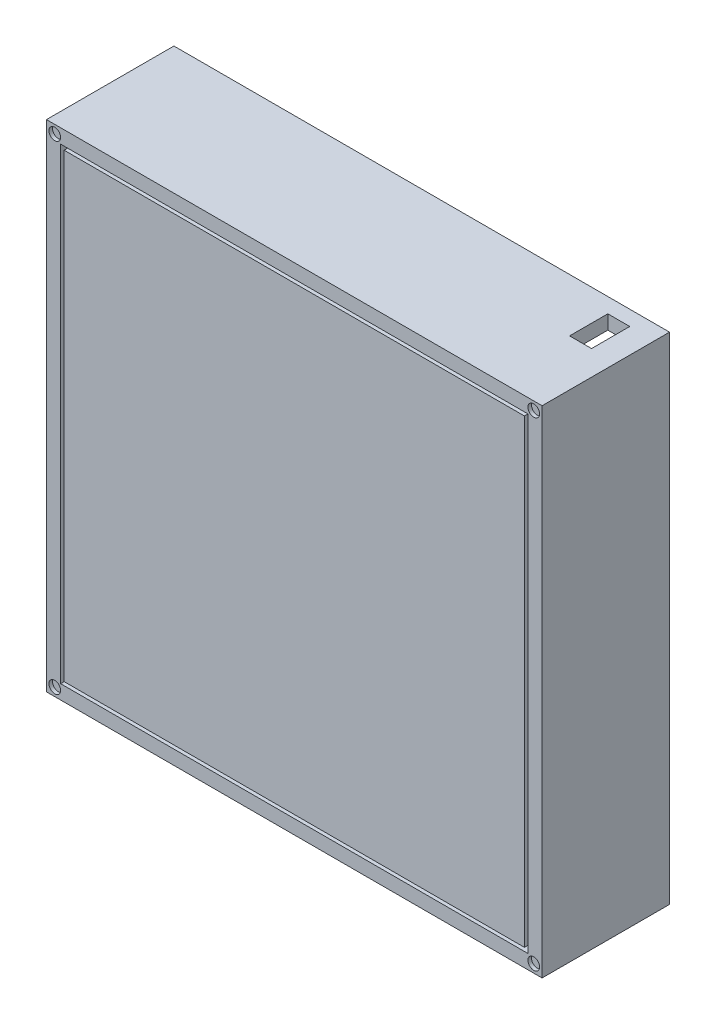
ISO-10303-21;
HEADER;
FILE_DESCRIPTION(('STEP AP214'),'2;1');
FILE_NAME('part.step','',(''),(''),'','','');
FILE_SCHEMA(('AUTOMOTIVE_DESIGN { 1 0 10303 214 1 1 1 1 }'));
ENDSEC;
DATA;
#1=APPLICATION_CONTEXT('core data for automotive mechanical design processes');
#2=APPLICATION_PROTOCOL_DEFINITION('international standard','automotive_design',2000,#1);
#3=PRODUCT_CONTEXT('',#1,'mechanical');
#4=PRODUCT('Part','Part','',(#3));
#5=PRODUCT_RELATED_PRODUCT_CATEGORY('part','',(#4));
#6=PRODUCT_DEFINITION_FORMATION('','',#4);
#7=PRODUCT_DEFINITION_CONTEXT('part definition',#1,'design');
#8=PRODUCT_DEFINITION('design','',#6,#7);
#9=PRODUCT_DEFINITION_SHAPE('','',#8);
#10=(LENGTH_UNIT() NAMED_UNIT(*) SI_UNIT(.MILLI.,.METRE.));
#11=(NAMED_UNIT(*) PLANE_ANGLE_UNIT() SI_UNIT($,.RADIAN.));
#12=(NAMED_UNIT(*) SI_UNIT($,.STERADIAN.) SOLID_ANGLE_UNIT());
#13=UNCERTAINTY_MEASURE_WITH_UNIT(LENGTH_MEASURE(1.E-05),#10,'distance_accuracy_value','');
#14=(GEOMETRIC_REPRESENTATION_CONTEXT(3) GLOBAL_UNCERTAINTY_ASSIGNED_CONTEXT((#13)) GLOBAL_UNIT_ASSIGNED_CONTEXT((#10,
#11,#12)) REPRESENTATION_CONTEXT('',''));
#15=CARTESIAN_POINT('',(0.,0.,0.));
#16=DIRECTION('',(0.,0.,1.));
#17=DIRECTION('',(1.,0.,0.));
#18=AXIS2_PLACEMENT_3D('',#15,#16,#17);
#19=CARTESIAN_POINT('',(70.,70.,-26.));
#20=DIRECTION('',(0.,1.,0.));
#21=DIRECTION('',(-1.,0.,0.));
#22=AXIS2_PLACEMENT_3D('',#19,#20,#21);
#23=PLANE('',#22);
#24=DIRECTION('',(-1.,0.,0.));
#25=VECTOR('',#24,1.);
#26=CARTESIAN_POINT('',(70.,70.,10.));
#27=LINE('',#26,#25);
#28=CARTESIAN_POINT('',(70.,70.,10.));
#29=VERTEX_POINT('',#28);
#30=CARTESIAN_POINT('',(-70.,70.,10.));
#31=VERTEX_POINT('',#30);
#32=EDGE_CURVE('E341',#29,#31,#27,.T.);
#33=ORIENTED_EDGE('',*,*,#32,.F.);
#34=DIRECTION('',(0.,0.,1.));
#35=VECTOR('',#34,1.);
#36=CARTESIAN_POINT('',(70.,70.,-26.));
#37=LINE('',#36,#35);
#38=CARTESIAN_POINT('',(70.,70.,-26.));
#39=VERTEX_POINT('',#38);
#40=EDGE_CURVE('E372',#39,#29,#37,.T.);
#41=ORIENTED_EDGE('',*,*,#40,.F.);
#42=DIRECTION('',(-1.,0.,0.));
#43=VECTOR('',#42,1.);
#44=CARTESIAN_POINT('',(70.,70.,-26.));
#45=LINE('',#44,#43);
#46=CARTESIAN_POINT('',(-70.,70.,-26.));
#47=VERTEX_POINT('',#46);
#48=EDGE_CURVE('E348',#39,#47,#45,.T.);
#49=ORIENTED_EDGE('',*,*,#48,.T.);
#50=DIRECTION('',(0.,0.,1.));
#51=VECTOR('',#50,1.);
#52=CARTESIAN_POINT('',(-70.,70.,-26.));
#53=LINE('',#52,#51);
#54=EDGE_CURVE('E362',#47,#31,#53,.T.);
#55=ORIENTED_EDGE('',*,*,#54,.T.);
#56=EDGE_LOOP('',(#33,#41,#49,#55));
#57=FACE_BOUND('',#56,.T.);
#58=DIRECTION('',(0.,0.,-1.));
#59=VECTOR('',#58,1.);
#60=CARTESIAN_POINT('',(56.8,70.,-10.9680724745506));
#61=LINE('',#60,#59);
#62=CARTESIAN_POINT('',(56.8,70.,-10.9680724745506));
#63=VERTEX_POINT('',#62);
#64=CARTESIAN_POINT('',(56.8,70.,-21.7680724745506));
#65=VERTEX_POINT('',#64);
#66=EDGE_CURVE('E232',#63,#65,#61,.T.);
#67=ORIENTED_EDGE('',*,*,#66,.T.);
#68=DIRECTION('',(1.,0.,0.));
#69=VECTOR('',#68,1.);
#70=CARTESIAN_POINT('',(56.8,70.,-21.7680724745506));
#71=LINE('',#70,#69);
#72=CARTESIAN_POINT('',(63.,70.,-21.7680724745506));
#73=VERTEX_POINT('',#72);
#74=EDGE_CURVE('E93',#65,#73,#71,.T.);
#75=ORIENTED_EDGE('',*,*,#74,.T.);
#76=DIRECTION('',(0.,0.,-1.));
#77=VECTOR('',#76,1.);
#78=CARTESIAN_POINT('',(63.,70.,-10.9680724745506));
#79=LINE('',#78,#77);
#80=CARTESIAN_POINT('',(63.,70.,-10.9680724745506));
#81=VERTEX_POINT('',#80);
#82=EDGE_CURVE('E223',#81,#73,#79,.T.);
#83=ORIENTED_EDGE('',*,*,#82,.F.);
#84=DIRECTION('',(1.,0.,0.));
#85=VECTOR('',#84,1.);
#86=CARTESIAN_POINT('',(56.8,70.,-10.9680724745506));
#87=LINE('',#86,#85);
#88=EDGE_CURVE('E229',#63,#81,#87,.T.);
#89=ORIENTED_EDGE('',*,*,#88,.F.);
#90=EDGE_LOOP('',(#67,#75,#83,#89));
#91=FACE_BOUND('',#90,.T.);
#92=ADVANCED_FACE('F79',(#57,#91),#23,.T.);
#93=CARTESIAN_POINT('',(66.,66.,-26.));
#94=DIRECTION('',(0.,1.,0.));
#95=DIRECTION('',(0.,0.,1.));
#96=AXIS2_PLACEMENT_3D('',#93,#94,#95);
#97=PLANE('',#96);
#98=DIRECTION('',(-1.,0.,0.));
#99=VECTOR('',#98,1.);
#100=CARTESIAN_POINT('',(66.,66.,10.));
#101=LINE('',#100,#99);
#102=CARTESIAN_POINT('',(66.,66.,10.));
#103=VERTEX_POINT('',#102);
#104=CARTESIAN_POINT('',(-66.,66.,10.));
#105=VERTEX_POINT('',#104);
#106=EDGE_CURVE('E312',#103,#105,#101,.T.);
#107=ORIENTED_EDGE('',*,*,#106,.T.);
#108=DIRECTION('',(0.,0.,1.));
#109=VECTOR('',#108,1.);
#110=CARTESIAN_POINT('',(-66.,66.,-26.));
#111=LINE('',#110,#109);
#112=CARTESIAN_POINT('',(-66.,66.,-26.));
#113=VERTEX_POINT('',#112);
#114=EDGE_CURVE('E329',#113,#105,#111,.T.);
#115=ORIENTED_EDGE('',*,*,#114,.F.);
#116=DIRECTION('',(-1.,0.,0.));
#117=VECTOR('',#116,1.);
#118=CARTESIAN_POINT('',(66.,66.,-26.));
#119=LINE('',#118,#117);
#120=CARTESIAN_POINT('',(66.,66.,-26.));
#121=VERTEX_POINT('',#120);
#122=EDGE_CURVE('E315',#121,#113,#119,.T.);
#123=ORIENTED_EDGE('',*,*,#122,.F.);
#124=DIRECTION('',(0.,0.,1.));
#125=VECTOR('',#124,1.);
#126=CARTESIAN_POINT('',(66.,66.,-26.));
#127=LINE('',#126,#125);
#128=EDGE_CURVE('E339',#121,#103,#127,.T.);
#129=ORIENTED_EDGE('',*,*,#128,.T.);
#130=EDGE_LOOP('',(#107,#115,#123,#129));
#131=FACE_BOUND('',#130,.T.);
#132=DIRECTION('',(1.,0.,0.));
#133=VECTOR('',#132,1.);
#134=CARTESIAN_POINT('',(66.,66.,-21.7680724745506));
#135=LINE('',#134,#133);
#136=CARTESIAN_POINT('',(56.8,66.,-21.7680724745506));
#137=VERTEX_POINT('',#136);
#138=CARTESIAN_POINT('',(63.,66.,-21.7680724745506));
#139=VERTEX_POINT('',#138);
#140=EDGE_CURVE('E13',#137,#139,#135,.T.);
#141=ORIENTED_EDGE('',*,*,#140,.F.);
#142=DIRECTION('',(0.,0.,-1.));
#143=VECTOR('',#142,1.);
#144=CARTESIAN_POINT('',(56.8,66.,-26.));
#145=LINE('',#144,#143);
#146=CARTESIAN_POINT('',(56.8,66.,-10.9680724745506));
#147=VERTEX_POINT('',#146);
#148=EDGE_CURVE('E374',#147,#137,#145,.T.);
#149=ORIENTED_EDGE('',*,*,#148,.F.);
#150=DIRECTION('',(1.,0.,0.));
#151=VECTOR('',#150,1.);
#152=CARTESIAN_POINT('',(66.,66.,-10.9680724745506));
#153=LINE('',#152,#151);
#154=CARTESIAN_POINT('',(63.,66.,-10.9680724745506));
#155=VERTEX_POINT('',#154);
#156=EDGE_CURVE('E382',#147,#155,#153,.T.);
#157=ORIENTED_EDGE('',*,*,#156,.T.);
#158=DIRECTION('',(0.,0.,-1.));
#159=VECTOR('',#158,1.);
#160=CARTESIAN_POINT('',(63.,66.,-26.));
#161=LINE('',#160,#159);
#162=EDGE_CURVE('E86',#155,#139,#161,.T.);
#163=ORIENTED_EDGE('',*,*,#162,.T.);
#164=EDGE_LOOP('',(#141,#149,#157,#163));
#165=FACE_BOUND('',#164,.T.);
#166=ADVANCED_FACE('F385',(#131,#165),#97,.F.);
#167=CARTESIAN_POINT('',(70.,-70.,-26.));
#168=DIRECTION('',(0.,1.,0.));
#169=DIRECTION('',(-1.,0.,0.));
#170=AXIS2_PLACEMENT_3D('',#167,#168,#169);
#171=PLANE('',#170);
#172=DIRECTION('',(0.,0.,-1.));
#173=VECTOR('',#172,1.);
#174=CARTESIAN_POINT('',(-46.,-70.,0.));
#175=LINE('',#174,#173);
#176=CARTESIAN_POINT('',(-46.,-70.,1.8));
#177=VERTEX_POINT('',#176);
#178=CARTESIAN_POINT('',(-46.,-70.,-26.));
#179=VERTEX_POINT('',#178);
#180=EDGE_CURVE('E248',#177,#179,#175,.T.);
#181=ORIENTED_EDGE('',*,*,#180,.T.);
#182=DIRECTION('',(-1.,0.,0.));
#183=VECTOR('',#182,1.);
#184=CARTESIAN_POINT('',(70.,-70.,-26.));
#185=LINE('',#184,#183);
#186=CARTESIAN_POINT('',(46.,-70.,-26.));
#187=VERTEX_POINT('',#186);
#188=EDGE_CURVE('E359',#187,#179,#185,.T.);
#189=ORIENTED_EDGE('',*,*,#188,.F.);
#190=DIRECTION('',(0.,0.,-1.));
#191=VECTOR('',#190,1.);
#192=CARTESIAN_POINT('',(46.,-70.,0.));
#193=LINE('',#192,#191);
#194=CARTESIAN_POINT('',(46.,-70.,1.8));
#195=VERTEX_POINT('',#194);
#196=EDGE_CURVE('E268',#195,#187,#193,.T.);
#197=ORIENTED_EDGE('',*,*,#196,.F.);
#198=DIRECTION('',(1.,0.,0.));
#199=VECTOR('',#198,1.);
#200=CARTESIAN_POINT('',(0.,-70.,1.8));
#201=LINE('',#200,#199);
#202=CARTESIAN_POINT('',(59.,-70.,1.8));
#203=VERTEX_POINT('',#202);
#204=EDGE_CURVE('E271',#195,#203,#201,.T.);
#205=ORIENTED_EDGE('',*,*,#204,.T.);
#206=DIRECTION('',(0.,0.,-1.));
#207=VECTOR('',#206,1.);
#208=CARTESIAN_POINT('',(59.,-70.,0.));
#209=LINE('',#208,#207);
#210=CARTESIAN_POINT('',(59.,-70.,-26.));
#211=VERTEX_POINT('',#210);
#212=EDGE_CURVE('E275',#203,#211,#209,.T.);
#213=ORIENTED_EDGE('',*,*,#212,.T.);
#214=CARTESIAN_POINT('',(70.,-70.,-26.));
#215=VERTEX_POINT('',#214);
#216=EDGE_CURVE('E355',#215,#211,#185,.T.);
#217=ORIENTED_EDGE('',*,*,#216,.F.);
#218=DIRECTION('',(0.,0.,1.));
#219=VECTOR('',#218,1.);
#220=CARTESIAN_POINT('',(70.,-70.,-26.));
#221=LINE('',#220,#219);
#222=CARTESIAN_POINT('',(70.,-70.,10.));
#223=VERTEX_POINT('',#222);
#224=EDGE_CURVE('E375',#215,#223,#221,.T.);
#225=ORIENTED_EDGE('',*,*,#224,.T.);
#226=DIRECTION('',(-1.,0.,0.));
#227=VECTOR('',#226,1.);
#228=CARTESIAN_POINT('',(70.,-70.,10.));
#229=LINE('',#228,#227);
#230=CARTESIAN_POINT('',(-70.,-70.,10.));
#231=VERTEX_POINT('',#230);
#232=EDGE_CURVE('E368',#223,#231,#229,.T.);
#233=ORIENTED_EDGE('',*,*,#232,.T.);
#234=DIRECTION('',(0.,0.,1.));
#235=VECTOR('',#234,1.);
#236=CARTESIAN_POINT('',(-70.,-70.,-26.));
#237=LINE('',#236,#235);
#238=CARTESIAN_POINT('',(-70.,-70.,-26.));
#239=VERTEX_POINT('',#238);
#240=EDGE_CURVE('E377',#239,#231,#237,.T.);
#241=ORIENTED_EDGE('',*,*,#240,.F.);
#242=CARTESIAN_POINT('',(-59.,-70.,-26.));
#243=VERTEX_POINT('',#242);
#244=EDGE_CURVE('E354',#243,#239,#185,.T.);
#245=ORIENTED_EDGE('',*,*,#244,.F.);
#246=DIRECTION('',(0.,0.,-1.));
#247=VECTOR('',#246,1.);
#248=CARTESIAN_POINT('',(-59.,-70.,0.));
#249=LINE('',#248,#247);
#250=CARTESIAN_POINT('',(-59.,-70.,1.8));
#251=VERTEX_POINT('',#250);
#252=EDGE_CURVE('E241',#251,#243,#249,.T.);
#253=ORIENTED_EDGE('',*,*,#252,.F.);
#254=DIRECTION('',(1.,0.,0.));
#255=VECTOR('',#254,1.);
#256=CARTESIAN_POINT('',(0.,-70.,1.8));
#257=LINE('',#256,#255);
#258=EDGE_CURVE('E244',#251,#177,#257,.T.);
#259=ORIENTED_EDGE('',*,*,#258,.T.);
#260=EDGE_LOOP('',(#181,#189,#197,#205,#213,#217,#225,#233,#241,#245,#253,#259));
#261=FACE_BOUND('',#260,.T.);
#262=ADVANCED_FACE('F402',(#261),#171,.F.);
#263=CARTESIAN_POINT('',(0.,0.,-26.));
#264=DIRECTION('',(0.,0.,-1.));
#265=DIRECTION('',(-1.,0.,0.));
#266=AXIS2_PLACEMENT_3D('',#263,#264,#265);
#267=PLANE('',#266);
#268=ORIENTED_EDGE('',*,*,#188,.T.);
#269=DIRECTION('',(0.,-1.,0.));
#270=VECTOR('',#269,1.);
#271=CARTESIAN_POINT('',(-46.,-35.3105881450947,-26.));
#272=LINE('',#271,#270);
#273=CARTESIAN_POINT('',(-46.,-66.,-26.));
#274=VERTEX_POINT('',#273);
#275=EDGE_CURVE('E251',#274,#179,#272,.T.);
#276=ORIENTED_EDGE('',*,*,#275,.F.);
#277=DIRECTION('',(-1.,0.,0.));
#278=VECTOR('',#277,1.);
#279=CARTESIAN_POINT('',(66.,-66.,-26.));
#280=LINE('',#279,#278);
#281=CARTESIAN_POINT('',(46.,-66.,-26.));
#282=VERTEX_POINT('',#281);
#283=EDGE_CURVE('E326',#282,#274,#280,.T.);
#284=ORIENTED_EDGE('',*,*,#283,.F.);
#285=DIRECTION('',(0.,-1.,0.));
#286=VECTOR('',#285,1.);
#287=CARTESIAN_POINT('',(46.,-35.3105881450947,-26.));
#288=LINE('',#287,#286);
#289=EDGE_CURVE('E282',#282,#187,#288,.T.);
#290=ORIENTED_EDGE('',*,*,#289,.T.);
#291=EDGE_LOOP('',(#268,#276,#284,#290));
#292=FACE_BOUND('',#291,.T.);
#293=ADVANCED_FACE('F468',(#292),#267,.T.);
#294=DIRECTION('',(0.,-1.,0.));
#295=VECTOR('',#294,1.);
#296=CARTESIAN_POINT('',(-59.,-35.3105881450947,-26.));
#297=LINE('',#296,#295);
#298=CARTESIAN_POINT('',(-59.,-66.,-26.));
#299=VERTEX_POINT('',#298);
#300=EDGE_CURVE('E256',#299,#243,#297,.T.);
#301=ORIENTED_EDGE('',*,*,#300,.T.);
#302=ORIENTED_EDGE('',*,*,#244,.T.);
#303=DIRECTION('',(0.,1.,0.));
#304=VECTOR('',#303,1.);
#305=CARTESIAN_POINT('',(-70.,-70.,-26.));
#306=LINE('',#305,#304);
#307=EDGE_CURVE('E351',#239,#47,#306,.T.);
#308=ORIENTED_EDGE('',*,*,#307,.T.);
#309=ORIENTED_EDGE('',*,*,#48,.F.);
#310=DIRECTION('',(0.,1.,0.));
#311=VECTOR('',#310,1.);
#312=CARTESIAN_POINT('',(70.,-70.,-26.));
#313=LINE('',#312,#311);
#314=EDGE_CURVE('E358',#215,#39,#313,.T.);
#315=ORIENTED_EDGE('',*,*,#314,.F.);
#316=ORIENTED_EDGE('',*,*,#216,.T.);
#317=DIRECTION('',(0.,-1.,0.));
#318=VECTOR('',#317,1.);
#319=CARTESIAN_POINT('',(59.,-35.3105881450947,-26.));
#320=LINE('',#319,#318);
#321=CARTESIAN_POINT('',(59.,-66.,-26.));
#322=VERTEX_POINT('',#321);
#323=EDGE_CURVE('E278',#322,#211,#320,.T.);
#324=ORIENTED_EDGE('',*,*,#323,.F.);
#325=CARTESIAN_POINT('',(66.,-66.,-26.));
#326=VERTEX_POINT('',#325);
#327=EDGE_CURVE('E322',#326,#322,#280,.T.);
#328=ORIENTED_EDGE('',*,*,#327,.F.);
#329=DIRECTION('',(0.,1.,0.));
#330=VECTOR('',#329,1.);
#331=CARTESIAN_POINT('',(66.,-66.,-26.));
#332=LINE('',#331,#330);
#333=EDGE_CURVE('E325',#326,#121,#332,.T.);
#334=ORIENTED_EDGE('',*,*,#333,.T.);
#335=ORIENTED_EDGE('',*,*,#122,.T.);
#336=DIRECTION('',(0.,1.,0.));
#337=VECTOR('',#336,1.);
#338=CARTESIAN_POINT('',(-66.,-66.,-26.));
#339=LINE('',#338,#337);
#340=CARTESIAN_POINT('',(-66.,-66.,-26.));
#341=VERTEX_POINT('',#340);
#342=EDGE_CURVE('E318',#341,#113,#339,.T.);
#343=ORIENTED_EDGE('',*,*,#342,.F.);
#344=EDGE_CURVE('E321',#299,#341,#280,.T.);
#345=ORIENTED_EDGE('',*,*,#344,.F.);
#346=EDGE_LOOP('',(#301,#302,#308,#309,#315,#316,#324,#328,#334,#335,#343,#345));
#347=FACE_BOUND('',#346,.T.);
#348=ADVANCED_FACE('F419',(#347),#267,.T.);
#349=CARTESIAN_POINT('',(66.,-66.,-26.));
#350=DIRECTION('',(0.,1.,0.));
#351=DIRECTION('',(0.,0.,1.));
#352=AXIS2_PLACEMENT_3D('',#349,#350,#351);
#353=PLANE('',#352);
#354=ORIENTED_EDGE('',*,*,#283,.T.);
#355=DIRECTION('',(0.,0.,-1.));
#356=VECTOR('',#355,1.);
#357=CARTESIAN_POINT('',(-46.,-66.,0.));
#358=LINE('',#357,#356);
#359=CARTESIAN_POINT('',(-46.,-66.,1.8));
#360=VERTEX_POINT('',#359);
#361=EDGE_CURVE('E257',#360,#274,#358,.T.);
#362=ORIENTED_EDGE('',*,*,#361,.F.);
#363=DIRECTION('',(1.,0.,0.));
#364=VECTOR('',#363,1.);
#365=CARTESIAN_POINT('',(0.,-66.,1.8));
#366=LINE('',#365,#364);
#367=CARTESIAN_POINT('',(-59.,-66.,1.8));
#368=VERTEX_POINT('',#367);
#369=EDGE_CURVE('E243',#368,#360,#366,.T.);
#370=ORIENTED_EDGE('',*,*,#369,.F.);
#371=DIRECTION('',(0.,0.,-1.));
#372=VECTOR('',#371,1.);
#373=CARTESIAN_POINT('',(-59.,-66.,0.));
#374=LINE('',#373,#372);
#375=EDGE_CURVE('E253',#368,#299,#374,.T.);
#376=ORIENTED_EDGE('',*,*,#375,.T.);
#377=ORIENTED_EDGE('',*,*,#344,.T.);
#378=DIRECTION('',(0.,0.,1.));
#379=VECTOR('',#378,1.);
#380=CARTESIAN_POINT('',(-66.,-66.,-26.));
#381=LINE('',#380,#379);
#382=CARTESIAN_POINT('',(-66.,-66.,10.));
#383=VERTEX_POINT('',#382);
#384=EDGE_CURVE('E344',#341,#383,#381,.T.);
#385=ORIENTED_EDGE('',*,*,#384,.T.);
#386=DIRECTION('',(-1.,0.,0.));
#387=VECTOR('',#386,1.);
#388=CARTESIAN_POINT('',(66.,-66.,10.));
#389=LINE('',#388,#387);
#390=CARTESIAN_POINT('',(66.,-66.,10.));
#391=VERTEX_POINT('',#390);
#392=EDGE_CURVE('E334',#391,#383,#389,.T.);
#393=ORIENTED_EDGE('',*,*,#392,.F.);
#394=DIRECTION('',(0.,0.,1.));
#395=VECTOR('',#394,1.);
#396=CARTESIAN_POINT('',(66.,-66.,-26.));
#397=LINE('',#396,#395);
#398=EDGE_CURVE('E342',#326,#391,#397,.T.);
#399=ORIENTED_EDGE('',*,*,#398,.F.);
#400=ORIENTED_EDGE('',*,*,#327,.T.);
#401=DIRECTION('',(0.,0.,-1.));
#402=VECTOR('',#401,1.);
#403=CARTESIAN_POINT('',(59.,-66.,0.));
#404=LINE('',#403,#402);
#405=CARTESIAN_POINT('',(59.,-66.,1.8));
#406=VERTEX_POINT('',#405);
#407=EDGE_CURVE('E267',#406,#322,#404,.T.);
#408=ORIENTED_EDGE('',*,*,#407,.F.);
#409=DIRECTION('',(1.,0.,0.));
#410=VECTOR('',#409,1.);
#411=CARTESIAN_POINT('',(0.,-66.,1.8));
#412=LINE('',#411,#410);
#413=CARTESIAN_POINT('',(46.,-66.,1.8));
#414=VERTEX_POINT('',#413);
#415=EDGE_CURVE('E270',#414,#406,#412,.T.);
#416=ORIENTED_EDGE('',*,*,#415,.F.);
#417=DIRECTION('',(0.,0.,-1.));
#418=VECTOR('',#417,1.);
#419=CARTESIAN_POINT('',(46.,-66.,0.));
#420=LINE('',#419,#418);
#421=EDGE_CURVE('E279',#414,#282,#420,.T.);
#422=ORIENTED_EDGE('',*,*,#421,.T.);
#423=EDGE_LOOP('',(#354,#362,#370,#376,#377,#385,#393,#399,#400,#408,#416,#422));
#424=FACE_BOUND('',#423,.T.);
#425=ADVANCED_FACE('F437',(#424),#353,.T.);
#426=CARTESIAN_POINT('',(0.,0.,10.));
#427=DIRECTION('',(0.,0.,-1.));
#428=DIRECTION('',(-1.,0.,0.));
#429=AXIS2_PLACEMENT_3D('',#426,#427,#428);
#430=PLANE('',#429);
#431=CARTESIAN_POINT('',(67.651,67.651,10.));
#432=DIRECTION('',(0.,0.,1.));
#433=DIRECTION('',(1.,0.,0.));
#434=AXIS2_PLACEMENT_3D('',#431,#432,#433);
#435=CIRCLE('',#434,1.65100000000001);
#436=CARTESIAN_POINT('',(69.302,67.651,10.));
#437=VERTEX_POINT('',#436);
#438=EDGE_CURVE('E291',#437,#437,#435,.T.);
#439=ORIENTED_EDGE('',*,*,#438,.F.);
#440=EDGE_LOOP('',(#439));
#441=FACE_BOUND('',#440,.T.);
#442=CARTESIAN_POINT('',(-67.651,67.651,10.));
#443=DIRECTION('',(0.,0.,-1.));
#444=DIRECTION('',(-1.,0.,0.));
#445=AXIS2_PLACEMENT_3D('',#442,#443,#444);
#446=CIRCLE('',#445,1.65100000000001);
#447=CARTESIAN_POINT('',(-69.302,67.651,10.));
#448=VERTEX_POINT('',#447);
#449=EDGE_CURVE('E294',#448,#448,#446,.T.);
#450=ORIENTED_EDGE('',*,*,#449,.T.);
#451=EDGE_LOOP('',(#450));
#452=FACE_BOUND('',#451,.T.);
#453=DIRECTION('',(0.,1.,0.));
#454=VECTOR('',#453,1.);
#455=CARTESIAN_POINT('',(-66.,-66.,10.));
#456=LINE('',#455,#454);
#457=EDGE_CURVE('E331',#383,#105,#456,.T.);
#458=ORIENTED_EDGE('',*,*,#457,.T.);
#459=ORIENTED_EDGE('',*,*,#106,.F.);
#460=DIRECTION('',(0.,1.,0.));
#461=VECTOR('',#460,1.);
#462=CARTESIAN_POINT('',(66.,-66.,10.));
#463=LINE('',#462,#461);
#464=EDGE_CURVE('E319',#391,#103,#463,.T.);
#465=ORIENTED_EDGE('',*,*,#464,.F.);
#466=ORIENTED_EDGE('',*,*,#392,.T.);
#467=EDGE_LOOP('',(#458,#459,#465,#466));
#468=FACE_BOUND('',#467,.T.);
#469=ORIENTED_EDGE('',*,*,#32,.T.);
#470=DIRECTION('',(0.,1.,0.));
#471=VECTOR('',#470,1.);
#472=CARTESIAN_POINT('',(-70.,-70.,10.));
#473=LINE('',#472,#471);
#474=EDGE_CURVE('E365',#231,#31,#473,.T.);
#475=ORIENTED_EDGE('',*,*,#474,.F.);
#476=ORIENTED_EDGE('',*,*,#232,.F.);
#477=DIRECTION('',(0.,1.,0.));
#478=VECTOR('',#477,1.);
#479=CARTESIAN_POINT('',(70.,-70.,10.));
#480=LINE('',#479,#478);
#481=EDGE_CURVE('E352',#223,#29,#480,.T.);
#482=ORIENTED_EDGE('',*,*,#481,.T.);
#483=EDGE_LOOP('',(#469,#475,#476,#482));
#484=FACE_BOUND('',#483,.T.);
#485=CARTESIAN_POINT('',(67.651,-67.651,10.));
#486=DIRECTION('',(0.,0.,-1.));
#487=DIRECTION('',(-1.,0.,0.));
#488=AXIS2_PLACEMENT_3D('',#485,#486,#487);
#489=CIRCLE('',#488,1.65100000000001);
#490=CARTESIAN_POINT('',(66.,-67.651,10.));
#491=VERTEX_POINT('',#490);
#492=EDGE_CURVE('E298',#491,#491,#489,.T.);
#493=ORIENTED_EDGE('',*,*,#492,.T.);
#494=EDGE_LOOP('',(#493));
#495=FACE_BOUND('',#494,.T.);
#496=CARTESIAN_POINT('',(-67.651,-67.651,10.));
#497=DIRECTION('',(0.,0.,1.));
#498=DIRECTION('',(1.,0.,0.));
#499=AXIS2_PLACEMENT_3D('',#496,#497,#498);
#500=CIRCLE('',#499,1.65100000000001);
#501=CARTESIAN_POINT('',(-66.,-67.651,10.));
#502=VERTEX_POINT('',#501);
#503=EDGE_CURVE('E304',#502,#502,#500,.T.);
#504=ORIENTED_EDGE('',*,*,#503,.F.);
#505=EDGE_LOOP('',(#504));
#506=FACE_BOUND('',#505,.T.);
#507=ADVANCED_FACE('F412',(#441,#452,#468,#484,#495,#506),#430,.F.);
#508=CARTESIAN_POINT('',(70.,-70.,-26.));
#509=DIRECTION('',(1.,0.,0.));
#510=DIRECTION('',(0.,0.,-1.));
#511=AXIS2_PLACEMENT_3D('',#508,#509,#510);
#512=PLANE('',#511);
#513=ORIENTED_EDGE('',*,*,#481,.F.);
#514=ORIENTED_EDGE('',*,*,#224,.F.);
#515=ORIENTED_EDGE('',*,*,#314,.T.);
#516=ORIENTED_EDGE('',*,*,#40,.T.);
#517=EDGE_LOOP('',(#513,#514,#515,#516));
#518=FACE_BOUND('',#517,.T.);
#519=ADVANCED_FACE('F415',(#518),#512,.T.);
#520=CARTESIAN_POINT('',(-70.,-70.,-26.));
#521=DIRECTION('',(1.,0.,0.));
#522=DIRECTION('',(0.,0.,-1.));
#523=AXIS2_PLACEMENT_3D('',#520,#521,#522);
#524=PLANE('',#523);
#525=ORIENTED_EDGE('',*,*,#474,.T.);
#526=ORIENTED_EDGE('',*,*,#54,.F.);
#527=ORIENTED_EDGE('',*,*,#307,.F.);
#528=ORIENTED_EDGE('',*,*,#240,.T.);
#529=EDGE_LOOP('',(#525,#526,#527,#528));
#530=FACE_BOUND('',#529,.T.);
#531=ADVANCED_FACE('F425',(#530),#524,.F.);
#532=CARTESIAN_POINT('',(66.,-66.,-26.));
#533=DIRECTION('',(1.,0.,0.));
#534=DIRECTION('',(0.,0.,-1.));
#535=AXIS2_PLACEMENT_3D('',#532,#533,#534);
#536=PLANE('',#535);
#537=ORIENTED_EDGE('',*,*,#464,.T.);
#538=ORIENTED_EDGE('',*,*,#128,.F.);
#539=ORIENTED_EDGE('',*,*,#333,.F.);
#540=ORIENTED_EDGE('',*,*,#398,.T.);
#541=EDGE_LOOP('',(#537,#538,#539,#540));
#542=FACE_BOUND('',#541,.T.);
#543=ADVANCED_FACE('F443',(#542),#536,.F.);
#544=CARTESIAN_POINT('',(-66.,-66.,-26.));
#545=DIRECTION('',(1.,0.,0.));
#546=DIRECTION('',(0.,0.,-1.));
#547=AXIS2_PLACEMENT_3D('',#544,#545,#546);
#548=PLANE('',#547);
#549=ORIENTED_EDGE('',*,*,#457,.F.);
#550=ORIENTED_EDGE('',*,*,#384,.F.);
#551=ORIENTED_EDGE('',*,*,#342,.T.);
#552=ORIENTED_EDGE('',*,*,#114,.T.);
#553=EDGE_LOOP('',(#549,#550,#551,#552));
#554=FACE_BOUND('',#553,.T.);
#555=ADVANCED_FACE('F451',(#554),#548,.T.);
#556=CARTESIAN_POINT('',(-67.651,67.651,8.98));
#557=DIRECTION('',(0.,0.,1.));
#558=DIRECTION('',(1.,0.,0.));
#559=AXIS2_PLACEMENT_3D('',#556,#557,#558);
#560=CYLINDRICAL_SURFACE('',#559,1.65100000000001);
#561=CARTESIAN_POINT('',(-67.651,67.651,8.98));
#562=DIRECTION('',(0.,0.,-1.));
#563=DIRECTION('',(-1.,0.,0.));
#564=AXIS2_PLACEMENT_3D('',#561,#562,#563);
#565=CIRCLE('',#564,1.65100000000001);
#566=CARTESIAN_POINT('',(-69.302,67.651,8.98));
#567=VERTEX_POINT('',#566);
#568=EDGE_CURVE('E309',#567,#567,#565,.T.);
#569=ORIENTED_EDGE('',*,*,#568,.T.);
#570=EDGE_LOOP('',(#569));
#571=FACE_BOUND('',#570,.T.);
#572=ORIENTED_EDGE('',*,*,#449,.F.);
#573=EDGE_LOOP('',(#572));
#574=FACE_BOUND('',#573,.T.);
#575=ADVANCED_FACE('F478',(#571,#574),#560,.F.);
#576=CARTESIAN_POINT('',(-67.651,67.651,8.98));
#577=DIRECTION('',(0.,0.,-1.));
#578=DIRECTION('',(-1.,0.,0.));
#579=AXIS2_PLACEMENT_3D('',#576,#577,#578);
#580=PLANE('',#579);
#581=ORIENTED_EDGE('',*,*,#568,.F.);
#582=EDGE_LOOP('',(#581));
#583=FACE_BOUND('',#582,.T.);
#584=ADVANCED_FACE('F482',(#583),#580,.F.);
#585=CARTESIAN_POINT('',(67.651,67.651,8.98));
#586=DIRECTION('',(0.,0.,1.));
#587=DIRECTION('',(1.,0.,0.));
#588=AXIS2_PLACEMENT_3D('',#585,#586,#587);
#589=CYLINDRICAL_SURFACE('',#588,1.65100000000001);
#590=CARTESIAN_POINT('',(67.651,67.651,8.98));
#591=DIRECTION('',(0.,0.,1.));
#592=DIRECTION('',(1.,0.,0.));
#593=AXIS2_PLACEMENT_3D('',#590,#591,#592);
#594=CIRCLE('',#593,1.65100000000001);
#595=CARTESIAN_POINT('',(69.302,67.651,8.98));
#596=VERTEX_POINT('',#595);
#597=EDGE_CURVE('E295',#596,#596,#594,.T.);
#598=ORIENTED_EDGE('',*,*,#597,.F.);
#599=EDGE_LOOP('',(#598));
#600=FACE_BOUND('',#599,.T.);
#601=ORIENTED_EDGE('',*,*,#438,.T.);
#602=EDGE_LOOP('',(#601));
#603=FACE_BOUND('',#602,.T.);
#604=ADVANCED_FACE('F486',(#600,#603),#589,.F.);
#605=CARTESIAN_POINT('',(67.651,67.651,8.98));
#606=DIRECTION('',(0.,0.,1.));
#607=DIRECTION('',(1.,0.,0.));
#608=AXIS2_PLACEMENT_3D('',#605,#606,#607);
#609=PLANE('',#608);
#610=ORIENTED_EDGE('',*,*,#597,.T.);
#611=EDGE_LOOP('',(#610));
#612=FACE_BOUND('',#611,.T.);
#613=ADVANCED_FACE('F503',(#612),#609,.T.);
#614=CARTESIAN_POINT('',(67.651,-67.651,8.98));
#615=DIRECTION('',(0.,0.,1.));
#616=DIRECTION('',(1.,0.,0.));
#617=AXIS2_PLACEMENT_3D('',#614,#615,#616);
#618=CYLINDRICAL_SURFACE('',#617,1.65100000000001);
#619=CARTESIAN_POINT('',(67.651,-67.651,8.98));
#620=DIRECTION('',(0.,0.,-1.));
#621=DIRECTION('',(-1.,0.,0.));
#622=AXIS2_PLACEMENT_3D('',#619,#620,#621);
#623=CIRCLE('',#622,1.65100000000001);
#624=CARTESIAN_POINT('',(66.,-67.651,8.98));
#625=VERTEX_POINT('',#624);
#626=EDGE_CURVE('E301',#625,#625,#623,.T.);
#627=ORIENTED_EDGE('',*,*,#626,.T.);
#628=EDGE_LOOP('',(#627));
#629=FACE_BOUND('',#628,.T.);
#630=ORIENTED_EDGE('',*,*,#492,.F.);
#631=EDGE_LOOP('',(#630));
#632=FACE_BOUND('',#631,.T.);
#633=ADVANCED_FACE('F499',(#629,#632),#618,.F.);
#634=CARTESIAN_POINT('',(67.651,-67.651,8.98));
#635=DIRECTION('',(0.,0.,-1.));
#636=DIRECTION('',(-1.,0.,0.));
#637=AXIS2_PLACEMENT_3D('',#634,#635,#636);
#638=PLANE('',#637);
#639=ORIENTED_EDGE('',*,*,#626,.F.);
#640=EDGE_LOOP('',(#639));
#641=FACE_BOUND('',#640,.T.);
#642=ADVANCED_FACE('F495',(#641),#638,.F.);
#643=CARTESIAN_POINT('',(-67.651,-67.651,8.98));
#644=DIRECTION('',(0.,0.,1.));
#645=DIRECTION('',(1.,0.,0.));
#646=AXIS2_PLACEMENT_3D('',#643,#644,#645);
#647=CYLINDRICAL_SURFACE('',#646,1.65100000000001);
#648=CARTESIAN_POINT('',(-67.651,-67.651,8.98));
#649=DIRECTION('',(0.,0.,1.));
#650=DIRECTION('',(1.,0.,0.));
#651=AXIS2_PLACEMENT_3D('',#648,#649,#650);
#652=CIRCLE('',#651,1.65100000000001);
#653=CARTESIAN_POINT('',(-66.,-67.651,8.98));
#654=VERTEX_POINT('',#653);
#655=EDGE_CURVE('E259',#654,#654,#652,.T.);
#656=ORIENTED_EDGE('',*,*,#655,.F.);
#657=EDGE_LOOP('',(#656));
#658=FACE_BOUND('',#657,.T.);
#659=ORIENTED_EDGE('',*,*,#503,.T.);
#660=EDGE_LOOP('',(#659));
#661=FACE_BOUND('',#660,.T.);
#662=ADVANCED_FACE('F491',(#658,#661),#647,.F.);
#663=CARTESIAN_POINT('',(-67.651,-67.651,8.98));
#664=DIRECTION('',(0.,0.,1.));
#665=DIRECTION('',(1.,0.,0.));
#666=AXIS2_PLACEMENT_3D('',#663,#664,#665);
#667=PLANE('',#666);
#668=ORIENTED_EDGE('',*,*,#655,.T.);
#669=EDGE_LOOP('',(#668));
#670=FACE_BOUND('',#669,.T.);
#671=ADVANCED_FACE('F488',(#670),#667,.T.);
#672=CARTESIAN_POINT('',(59.,-35.3105881450947,0.));
#673=DIRECTION('',(-1.,0.,0.));
#674=DIRECTION('',(0.,0.,1.));
#675=AXIS2_PLACEMENT_3D('',#672,#673,#674);
#676=PLANE('',#675);
#677=ORIENTED_EDGE('',*,*,#407,.T.);
#678=ORIENTED_EDGE('',*,*,#323,.T.);
#679=ORIENTED_EDGE('',*,*,#212,.F.);
#680=DIRECTION('',(0.,-1.,0.));
#681=VECTOR('',#680,1.);
#682=CARTESIAN_POINT('',(59.,-35.3105881450947,1.8));
#683=LINE('',#682,#681);
#684=EDGE_CURVE('E219',#406,#203,#683,.T.);
#685=ORIENTED_EDGE('',*,*,#684,.F.);
#686=EDGE_LOOP('',(#677,#678,#679,#685));
#687=FACE_BOUND('',#686,.T.);
#688=ADVANCED_FACE('F432',(#687),#676,.T.);
#689=CARTESIAN_POINT('',(46.,-35.3105881450947,0.));
#690=DIRECTION('',(-1.,0.,0.));
#691=DIRECTION('',(0.,-1.,0.));
#692=AXIS2_PLACEMENT_3D('',#689,#690,#691);
#693=PLANE('',#692);
#694=DIRECTION('',(0.,-1.,0.));
#695=VECTOR('',#694,1.);
#696=CARTESIAN_POINT('',(46.,-35.3105881450947,1.8));
#697=LINE('',#696,#695);
#698=EDGE_CURVE('E274',#414,#195,#697,.T.);
#699=ORIENTED_EDGE('',*,*,#698,.T.);
#700=ORIENTED_EDGE('',*,*,#196,.T.);
#701=ORIENTED_EDGE('',*,*,#289,.F.);
#702=ORIENTED_EDGE('',*,*,#421,.F.);
#703=EDGE_LOOP('',(#699,#700,#701,#702));
#704=FACE_BOUND('',#703,.T.);
#705=ADVANCED_FACE('F513',(#704),#693,.F.);
#706=CARTESIAN_POINT('',(0.,-35.3105881450947,1.8));
#707=DIRECTION('',(0.,0.,-1.));
#708=DIRECTION('',(-1.,0.,0.));
#709=AXIS2_PLACEMENT_3D('',#706,#707,#708);
#710=PLANE('',#709);
#711=ORIENTED_EDGE('',*,*,#415,.T.);
#712=ORIENTED_EDGE('',*,*,#684,.T.);
#713=ORIENTED_EDGE('',*,*,#204,.F.);
#714=ORIENTED_EDGE('',*,*,#698,.F.);
#715=EDGE_LOOP('',(#711,#712,#713,#714));
#716=FACE_BOUND('',#715,.T.);
#717=ADVANCED_FACE('F516',(#716),#710,.T.);
#718=CARTESIAN_POINT('',(-46.,-35.3105881450947,0.));
#719=DIRECTION('',(-1.,0.,0.));
#720=DIRECTION('',(0.,-1.,0.));
#721=AXIS2_PLACEMENT_3D('',#718,#719,#720);
#722=PLANE('',#721);
#723=ORIENTED_EDGE('',*,*,#361,.T.);
#724=ORIENTED_EDGE('',*,*,#275,.T.);
#725=ORIENTED_EDGE('',*,*,#180,.F.);
#726=DIRECTION('',(0.,-1.,0.));
#727=VECTOR('',#726,1.);
#728=CARTESIAN_POINT('',(-46.,-35.3105881450947,1.8));
#729=LINE('',#728,#727);
#730=EDGE_CURVE('E252',#360,#177,#729,.T.);
#731=ORIENTED_EDGE('',*,*,#730,.F.);
#732=EDGE_LOOP('',(#723,#724,#725,#731));
#733=FACE_BOUND('',#732,.T.);
#734=ADVANCED_FACE('F520',(#733),#722,.T.);
#735=CARTESIAN_POINT('',(-59.,-35.3105881450947,0.));
#736=DIRECTION('',(-1.,0.,0.));
#737=DIRECTION('',(0.,-1.,0.));
#738=AXIS2_PLACEMENT_3D('',#735,#736,#737);
#739=PLANE('',#738);
#740=DIRECTION('',(0.,-1.,0.));
#741=VECTOR('',#740,1.);
#742=CARTESIAN_POINT('',(-59.,-35.3105881450947,1.8));
#743=LINE('',#742,#741);
#744=EDGE_CURVE('E247',#368,#251,#743,.T.);
#745=ORIENTED_EDGE('',*,*,#744,.T.);
#746=ORIENTED_EDGE('',*,*,#252,.T.);
#747=ORIENTED_EDGE('',*,*,#300,.F.);
#748=ORIENTED_EDGE('',*,*,#375,.F.);
#749=EDGE_LOOP('',(#745,#746,#747,#748));
#750=FACE_BOUND('',#749,.T.);
#751=ADVANCED_FACE('F524',(#750),#739,.F.);
#752=CARTESIAN_POINT('',(0.,-35.3105881450947,1.8));
#753=DIRECTION('',(0.,0.,-1.));
#754=DIRECTION('',(-1.,0.,0.));
#755=AXIS2_PLACEMENT_3D('',#752,#753,#754);
#756=PLANE('',#755);
#757=ORIENTED_EDGE('',*,*,#369,.T.);
#758=ORIENTED_EDGE('',*,*,#730,.T.);
#759=ORIENTED_EDGE('',*,*,#258,.F.);
#760=ORIENTED_EDGE('',*,*,#744,.F.);
#761=EDGE_LOOP('',(#757,#758,#759,#760));
#762=FACE_BOUND('',#761,.T.);
#763=ADVANCED_FACE('F528',(#762),#756,.T.);
#764=CARTESIAN_POINT('',(56.8,60.,-21.7680724745506));
#765=DIRECTION('',(0.,0.,1.));
#766=DIRECTION('',(1.,0.,0.));
#767=AXIS2_PLACEMENT_3D('',#764,#765,#766);
#768=PLANE('',#767);
#769=ORIENTED_EDGE('',*,*,#140,.T.);
#770=DIRECTION('',(0.,1.,0.));
#771=VECTOR('',#770,1.);
#772=CARTESIAN_POINT('',(63.,60.,-21.7680724745506));
#773=LINE('',#772,#771);
#774=EDGE_CURVE('E213',#139,#73,#773,.T.);
#775=ORIENTED_EDGE('',*,*,#774,.T.);
#776=ORIENTED_EDGE('',*,*,#74,.F.);
#777=DIRECTION('',(0.,1.,0.));
#778=VECTOR('',#777,1.);
#779=CARTESIAN_POINT('',(56.8,60.,-21.7680724745506));
#780=LINE('',#779,#778);
#781=EDGE_CURVE('E237',#137,#65,#780,.T.);
#782=ORIENTED_EDGE('',*,*,#781,.F.);
#783=EDGE_LOOP('',(#769,#775,#776,#782));
#784=FACE_BOUND('',#783,.T.);
#785=ADVANCED_FACE('F215',(#784),#768,.T.);
#786=CARTESIAN_POINT('',(63.,60.,-10.9680724745506));
#787=DIRECTION('',(1.,0.,0.));
#788=DIRECTION('',(0.,1.,0.));
#789=AXIS2_PLACEMENT_3D('',#786,#787,#788);
#790=PLANE('',#789);
#791=DIRECTION('',(0.,1.,0.));
#792=VECTOR('',#791,1.);
#793=CARTESIAN_POINT('',(63.,60.,-10.9680724745506));
#794=LINE('',#793,#792);
#795=EDGE_CURVE('E220',#155,#81,#794,.T.);
#796=ORIENTED_EDGE('',*,*,#795,.T.);
#797=ORIENTED_EDGE('',*,*,#82,.T.);
#798=ORIENTED_EDGE('',*,*,#774,.F.);
#799=ORIENTED_EDGE('',*,*,#162,.F.);
#800=EDGE_LOOP('',(#796,#797,#798,#799));
#801=FACE_BOUND('',#800,.T.);
#802=ADVANCED_FACE('F224',(#801),#790,.F.);
#803=CARTESIAN_POINT('',(56.8,60.,-10.9680724745506));
#804=DIRECTION('',(0.,0.,1.));
#805=DIRECTION('',(1.,0.,0.));
#806=AXIS2_PLACEMENT_3D('',#803,#804,#805);
#807=PLANE('',#806);
#808=DIRECTION('',(0.,1.,0.));
#809=VECTOR('',#808,1.);
#810=CARTESIAN_POINT('',(56.8,60.,-10.9680724745506));
#811=LINE('',#810,#809);
#812=EDGE_CURVE('E101',#147,#63,#811,.T.);
#813=ORIENTED_EDGE('',*,*,#812,.T.);
#814=ORIENTED_EDGE('',*,*,#88,.T.);
#815=ORIENTED_EDGE('',*,*,#795,.F.);
#816=ORIENTED_EDGE('',*,*,#156,.F.);
#817=EDGE_LOOP('',(#813,#814,#815,#816));
#818=FACE_BOUND('',#817,.T.);
#819=ADVANCED_FACE('F388',(#818),#807,.F.);
#820=CARTESIAN_POINT('',(56.8,60.,-10.9680724745506));
#821=DIRECTION('',(1.,0.,0.));
#822=DIRECTION('',(0.,1.,0.));
#823=AXIS2_PLACEMENT_3D('',#820,#821,#822);
#824=PLANE('',#823);
#825=ORIENTED_EDGE('',*,*,#148,.T.);
#826=ORIENTED_EDGE('',*,*,#781,.T.);
#827=ORIENTED_EDGE('',*,*,#66,.F.);
#828=ORIENTED_EDGE('',*,*,#812,.F.);
#829=EDGE_LOOP('',(#825,#826,#827,#828));
#830=FACE_BOUND('',#829,.T.);
#831=ADVANCED_FACE('F389',(#830),#824,.T.);
#832=CLOSED_SHELL('',(#92,#166,#262,#293,#348,#425,#507,#519,#531,#543,#555,#575,#584,#604,#613,
#633,#642,#662,#671,#688,#705,#717,#734,#751,#763,#785,#802,#819,#831));
#833=MANIFOLD_SOLID_BREP('B2',#832);
#834=CARTESIAN_POINT('',(-65.,-65.,10.));
#835=DIRECTION('',(1.,0.,0.));
#836=DIRECTION('',(0.,0.,-1.));
#837=AXIS2_PLACEMENT_3D('',#834,#835,#836);
#838=PLANE('',#837);
#839=DIRECTION('',(0.,-1.,0.));
#840=VECTOR('',#839,1.);
#841=CARTESIAN_POINT('',(-65.,-65.,0.));
#842=LINE('',#841,#840);
#843=CARTESIAN_POINT('',(-65.,65.,0.));
#844=VERTEX_POINT('',#843);
#845=CARTESIAN_POINT('',(-65.,-65.,0.));
#846=VERTEX_POINT('',#845);
#847=EDGE_CURVE('E789',#844,#846,#842,.T.);
#848=ORIENTED_EDGE('',*,*,#847,.T.);
#849=DIRECTION('',(0.,0.,-1.));
#850=VECTOR('',#849,1.);
#851=CARTESIAN_POINT('',(-65.,-65.,10.));
#852=LINE('',#851,#850);
#853=CARTESIAN_POINT('',(-65.,-65.,10.));
#854=VERTEX_POINT('',#853);
#855=EDGE_CURVE('E77',#854,#846,#852,.T.);
#856=ORIENTED_EDGE('',*,*,#855,.F.);
#857=DIRECTION('',(0.,-1.,0.));
#858=VECTOR('',#857,1.);
#859=CARTESIAN_POINT('',(-65.,-65.,10.));
#860=LINE('',#859,#858);
#861=CARTESIAN_POINT('',(-65.,65.,10.));
#862=VERTEX_POINT('',#861);
#863=EDGE_CURVE('E777',#862,#854,#860,.T.);
#864=ORIENTED_EDGE('',*,*,#863,.F.);
#865=DIRECTION('',(0.,0.,-1.));
#866=VECTOR('',#865,1.);
#867=CARTESIAN_POINT('',(-65.,65.,10.));
#868=LINE('',#867,#866);
#869=EDGE_CURVE('E785',#862,#844,#868,.T.);
#870=ORIENTED_EDGE('',*,*,#869,.T.);
#871=EDGE_LOOP('',(#848,#856,#864,#870));
#872=FACE_BOUND('',#871,.T.);
#873=ADVANCED_FACE('F726',(#872),#838,.F.);
#874=CARTESIAN_POINT('',(65.,-65.,10.));
#875=DIRECTION('',(0.,1.,0.));
#876=DIRECTION('',(-1.,0.,0.));
#877=AXIS2_PLACEMENT_3D('',#874,#875,#876);
#878=PLANE('',#877);
#879=DIRECTION('',(1.,0.,0.));
#880=VECTOR('',#879,1.);
#881=CARTESIAN_POINT('',(65.,-65.,0.));
#882=LINE('',#881,#880);
#883=CARTESIAN_POINT('',(65.,-65.,0.));
#884=VERTEX_POINT('',#883);
#885=EDGE_CURVE('E781',#846,#884,#882,.T.);
#886=ORIENTED_EDGE('',*,*,#885,.T.);
#887=DIRECTION('',(0.,0.,-1.));
#888=VECTOR('',#887,1.);
#889=CARTESIAN_POINT('',(65.,-65.,10.));
#890=LINE('',#889,#888);
#891=CARTESIAN_POINT('',(65.,-65.,10.));
#892=VERTEX_POINT('',#891);
#893=EDGE_CURVE('E734',#892,#884,#890,.T.);
#894=ORIENTED_EDGE('',*,*,#893,.F.);
#895=DIRECTION('',(1.,0.,0.));
#896=VECTOR('',#895,1.);
#897=CARTESIAN_POINT('',(65.,-65.,10.));
#898=LINE('',#897,#896);
#899=EDGE_CURVE('E772',#854,#892,#898,.T.);
#900=ORIENTED_EDGE('',*,*,#899,.F.);
#901=ORIENTED_EDGE('',*,*,#855,.T.);
#902=EDGE_LOOP('',(#886,#894,#900,#901));
#903=FACE_BOUND('',#902,.T.);
#904=ADVANCED_FACE('F780',(#903),#878,.F.);
#905=CARTESIAN_POINT('',(65.,-65.,10.));
#906=DIRECTION('',(-1.,0.,0.));
#907=DIRECTION('',(0.,0.,1.));
#908=AXIS2_PLACEMENT_3D('',#905,#906,#907);
#909=PLANE('',#908);
#910=DIRECTION('',(0.,1.,0.));
#911=VECTOR('',#910,1.);
#912=CARTESIAN_POINT('',(65.,-65.,0.));
#913=LINE('',#912,#911);
#914=CARTESIAN_POINT('',(65.,65.,0.));
#915=VERTEX_POINT('',#914);
#916=EDGE_CURVE('E759',#884,#915,#913,.T.);
#917=ORIENTED_EDGE('',*,*,#916,.T.);
#918=DIRECTION('',(0.,0.,-1.));
#919=VECTOR('',#918,1.);
#920=CARTESIAN_POINT('',(65.,65.,10.));
#921=LINE('',#920,#919);
#922=CARTESIAN_POINT('',(65.,65.,10.));
#923=VERTEX_POINT('',#922);
#924=EDGE_CURVE('E782',#923,#915,#921,.T.);
#925=ORIENTED_EDGE('',*,*,#924,.F.);
#926=DIRECTION('',(0.,1.,0.));
#927=VECTOR('',#926,1.);
#928=CARTESIAN_POINT('',(65.,-65.,10.));
#929=LINE('',#928,#927);
#930=EDGE_CURVE('E775',#892,#923,#929,.T.);
#931=ORIENTED_EDGE('',*,*,#930,.F.);
#932=ORIENTED_EDGE('',*,*,#893,.T.);
#933=EDGE_LOOP('',(#917,#925,#931,#932));
#934=FACE_BOUND('',#933,.T.);
#935=ADVANCED_FACE('F783',(#934),#909,.F.);
#936=CARTESIAN_POINT('',(65.,65.,10.));
#937=DIRECTION('',(0.,-1.,0.));
#938=DIRECTION('',(1.,0.,0.));
#939=AXIS2_PLACEMENT_3D('',#936,#937,#938);
#940=PLANE('',#939);
#941=DIRECTION('',(-1.,0.,0.));
#942=VECTOR('',#941,1.);
#943=CARTESIAN_POINT('',(65.,65.,0.));
#944=LINE('',#943,#942);
#945=EDGE_CURVE('E765',#915,#844,#944,.T.);
#946=ORIENTED_EDGE('',*,*,#945,.T.);
#947=ORIENTED_EDGE('',*,*,#869,.F.);
#948=DIRECTION('',(-1.,0.,0.));
#949=VECTOR('',#948,1.);
#950=CARTESIAN_POINT('',(65.,65.,10.));
#951=LINE('',#950,#949);
#952=EDGE_CURVE('E742',#923,#862,#951,.T.);
#953=ORIENTED_EDGE('',*,*,#952,.F.);
#954=ORIENTED_EDGE('',*,*,#924,.T.);
#955=EDGE_LOOP('',(#946,#947,#953,#954));
#956=FACE_BOUND('',#955,.T.);
#957=ADVANCED_FACE('F796',(#956),#940,.F.);
#958=CARTESIAN_POINT('',(0.,0.,10.));
#959=DIRECTION('',(0.,0.,1.));
#960=DIRECTION('',(1.,0.,0.));
#961=AXIS2_PLACEMENT_3D('',#958,#959,#960);
#962=PLANE('',#961);
#963=ORIENTED_EDGE('',*,*,#863,.T.);
#964=ORIENTED_EDGE('',*,*,#899,.T.);
#965=ORIENTED_EDGE('',*,*,#930,.T.);
#966=ORIENTED_EDGE('',*,*,#952,.T.);
#967=EDGE_LOOP('',(#963,#964,#965,#966));
#968=FACE_BOUND('',#967,.T.);
#969=ADVANCED_FACE('F773',(#968),#962,.T.);
#970=CARTESIAN_POINT('',(0.,0.,0.));
#971=DIRECTION('',(0.,0.,1.));
#972=DIRECTION('',(1.,0.,0.));
#973=AXIS2_PLACEMENT_3D('',#970,#971,#972);
#974=PLANE('',#973);
#975=ORIENTED_EDGE('',*,*,#847,.F.);
#976=ORIENTED_EDGE('',*,*,#945,.F.);
#977=ORIENTED_EDGE('',*,*,#916,.F.);
#978=ORIENTED_EDGE('',*,*,#885,.F.);
#979=EDGE_LOOP('',(#975,#976,#977,#978));
#980=FACE_BOUND('',#979,.T.);
#981=ADVANCED_FACE('F799',(#980),#974,.F.);
#982=CLOSED_SHELL('',(#873,#904,#935,#957,#969,#981));
#983=MANIFOLD_SOLID_BREP('B7',#982);
#984=ADVANCED_BREP_SHAPE_REPRESENTATION('',(#18,#833,#983),#14);
#985=SHAPE_DEFINITION_REPRESENTATION(#9,#984);
ENDSEC;
END-ISO-10303-21;
